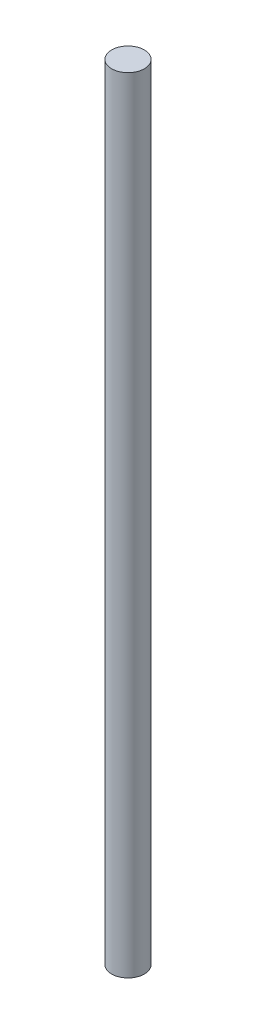
ISO-10303-21;
HEADER;
FILE_DESCRIPTION(('STEP AP214'),'2;1');
FILE_NAME('part.step','',(''),(''),'','','');
FILE_SCHEMA(('AUTOMOTIVE_DESIGN { 1 0 10303 214 1 1 1 1 }'));
ENDSEC;
DATA;
#1=APPLICATION_CONTEXT('core data for automotive mechanical design processes');
#2=APPLICATION_PROTOCOL_DEFINITION('international standard','automotive_design',2000,#1);
#3=PRODUCT_CONTEXT('',#1,'mechanical');
#4=PRODUCT('Part','Part','',(#3));
#5=PRODUCT_RELATED_PRODUCT_CATEGORY('part','',(#4));
#6=PRODUCT_DEFINITION_FORMATION('','',#4);
#7=PRODUCT_DEFINITION_CONTEXT('part definition',#1,'design');
#8=PRODUCT_DEFINITION('design','',#6,#7);
#9=PRODUCT_DEFINITION_SHAPE('','',#8);
#10=(LENGTH_UNIT() NAMED_UNIT(*) SI_UNIT(.MILLI.,.METRE.));
#11=(NAMED_UNIT(*) PLANE_ANGLE_UNIT() SI_UNIT($,.RADIAN.));
#12=(NAMED_UNIT(*) SI_UNIT($,.STERADIAN.) SOLID_ANGLE_UNIT());
#13=UNCERTAINTY_MEASURE_WITH_UNIT(LENGTH_MEASURE(1.E-05),#10,'distance_accuracy_value','');
#14=(GEOMETRIC_REPRESENTATION_CONTEXT(3) GLOBAL_UNCERTAINTY_ASSIGNED_CONTEXT((#13)) GLOBAL_UNIT_ASSIGNED_CONTEXT((#10,
#11,#12)) REPRESENTATION_CONTEXT('',''));
#15=CARTESIAN_POINT('',(0.,0.,0.));
#16=DIRECTION('',(0.,0.,1.));
#17=DIRECTION('',(1.,0.,0.));
#18=AXIS2_PLACEMENT_3D('',#15,#16,#17);
#19=CARTESIAN_POINT('',(0.,152.4,0.));
#20=DIRECTION('',(0.,-1.,0.));
#21=DIRECTION('',(0.,0.,-1.));
#22=AXIS2_PLACEMENT_3D('',#19,#20,#21);
#23=CYLINDRICAL_SURFACE('',#22,3.175);
#24=CARTESIAN_POINT('',(0.,152.4,0.));
#25=DIRECTION('',(0.,1.,0.));
#26=DIRECTION('',(0.,0.,1.));
#27=AXIS2_PLACEMENT_3D('',#24,#25,#26);
#28=CIRCLE('',#27,3.175);
#29=CARTESIAN_POINT('',(0.,152.4,-3.175));
#30=VERTEX_POINT('',#29);
#31=EDGE_CURVE('E10',#30,#30,#28,.T.);
#32=CARTESIAN_POINT('',(0.,0.,0.));
#33=DIRECTION('',(0.,1.,0.));
#34=DIRECTION('',(0.,0.,1.));
#35=AXIS2_PLACEMENT_3D('',#32,#33,#34);
#36=CIRCLE('',#35,3.175);
#37=CARTESIAN_POINT('',(0.,0.,-3.175));
#38=VERTEX_POINT('',#37);
#39=EDGE_CURVE('E34',#38,#38,#36,.T.);
#40=CARTESIAN_POINT('',(0.,152.4,-3.175));
#41=CARTESIAN_POINT('',(0.,150.8125,-3.175));
#42=CARTESIAN_POINT('',(0.,149.225,-3.175));
#43=CARTESIAN_POINT('',(0.,146.05,-3.175));
#44=CARTESIAN_POINT('',(0.,144.4625,-3.175));
#45=CARTESIAN_POINT('',(0.,141.2875,-3.175));
#46=CARTESIAN_POINT('',(0.,139.7,-3.175));
#47=CARTESIAN_POINT('',(0.,136.525,-3.175));
#48=CARTESIAN_POINT('',(0.,134.9375,-3.175));
#49=CARTESIAN_POINT('',(0.,131.7625,-3.175));
#50=CARTESIAN_POINT('',(0.,130.175,-3.175));
#51=CARTESIAN_POINT('',(0.,127.,-3.175));
#52=CARTESIAN_POINT('',(0.,125.4125,-3.175));
#53=CARTESIAN_POINT('',(0.,122.2375,-3.175));
#54=CARTESIAN_POINT('',(0.,120.65,-3.175));
#55=CARTESIAN_POINT('',(0.,117.475,-3.175));
#56=CARTESIAN_POINT('',(0.,115.8875,-3.175));
#57=CARTESIAN_POINT('',(0.,112.7125,-3.175));
#58=CARTESIAN_POINT('',(0.,111.125,-3.175));
#59=CARTESIAN_POINT('',(0.,107.95,-3.175));
#60=CARTESIAN_POINT('',(0.,106.3625,-3.175));
#61=CARTESIAN_POINT('',(0.,103.1875,-3.175));
#62=CARTESIAN_POINT('',(0.,101.6,-3.175));
#63=CARTESIAN_POINT('',(0.,98.425,-3.175));
#64=CARTESIAN_POINT('',(0.,96.8375,-3.175));
#65=CARTESIAN_POINT('',(0.,93.6625,-3.175));
#66=CARTESIAN_POINT('',(0.,92.075,-3.175));
#67=CARTESIAN_POINT('',(0.,88.9,-3.175));
#68=CARTESIAN_POINT('',(0.,87.3125,-3.175));
#69=CARTESIAN_POINT('',(0.,84.1375,-3.175));
#70=CARTESIAN_POINT('',(0.,82.55,-3.175));
#71=CARTESIAN_POINT('',(0.,79.375,-3.175));
#72=CARTESIAN_POINT('',(0.,77.7875,-3.175));
#73=CARTESIAN_POINT('',(0.,74.6125,-3.175));
#74=CARTESIAN_POINT('',(0.,73.025,-3.175));
#75=CARTESIAN_POINT('',(0.,69.85,-3.175));
#76=CARTESIAN_POINT('',(0.,68.2625,-3.175));
#77=CARTESIAN_POINT('',(0.,65.0875,-3.175));
#78=CARTESIAN_POINT('',(0.,63.5,-3.175));
#79=CARTESIAN_POINT('',(0.,60.325,-3.175));
#80=CARTESIAN_POINT('',(0.,58.7375,-3.175));
#81=CARTESIAN_POINT('',(0.,55.5625,-3.175));
#82=CARTESIAN_POINT('',(0.,53.975,-3.175));
#83=CARTESIAN_POINT('',(0.,50.8,-3.175));
#84=CARTESIAN_POINT('',(0.,49.2125,-3.175));
#85=CARTESIAN_POINT('',(0.,46.0375,-3.175));
#86=CARTESIAN_POINT('',(0.,44.45,-3.175));
#87=CARTESIAN_POINT('',(0.,41.275,-3.175));
#88=CARTESIAN_POINT('',(0.,39.6875,-3.175));
#89=CARTESIAN_POINT('',(0.,36.5125,-3.175));
#90=CARTESIAN_POINT('',(0.,34.925,-3.175));
#91=CARTESIAN_POINT('',(0.,31.75,-3.175));
#92=CARTESIAN_POINT('',(0.,30.1625,-3.175));
#93=CARTESIAN_POINT('',(0.,26.9875,-3.175));
#94=CARTESIAN_POINT('',(0.,25.4,-3.175));
#95=CARTESIAN_POINT('',(0.,22.225,-3.175));
#96=CARTESIAN_POINT('',(0.,20.6375,-3.175));
#97=CARTESIAN_POINT('',(0.,17.4625,-3.175));
#98=CARTESIAN_POINT('',(0.,15.875,-3.175));
#99=CARTESIAN_POINT('',(0.,12.7,-3.175));
#100=CARTESIAN_POINT('',(0.,11.1125,-3.175));
#101=CARTESIAN_POINT('',(0.,7.93750000000001,-3.175));
#102=CARTESIAN_POINT('',(0.,6.35,-3.175));
#103=CARTESIAN_POINT('',(0.,3.175,-3.175));
#104=CARTESIAN_POINT('',(0.,1.5875,-3.175));
#105=CARTESIAN_POINT('',(0.,0.,-3.175));
#106=B_SPLINE_CURVE_WITH_KNOTS('',3,(#40,#41,#42,#43,#44,#45,#46,#47,#48,#49,#50,#51,#52,#53,
#54,#55,#56,#57,#58,#59,#60,#61,#62,#63,#64,#65,#66,#67,#68,#69,#70,#71,#72,#73,#74,#75,#76,#77,
#78,#79,#80,#81,#82,#83,#84,#85,#86,#87,#88,#89,#90,#91,#92,#93,#94,#95,#96,#97,#98,#99,#100,
#101,#102,#103,#104,#105),.UNSPECIFIED.,.F.,.F.,(4,2,2,2,2,2,2,2,2,2,2,2,2,2,2,2,2,2,2,2,2,2,2,
2,2,2,2,2,2,2,2,2,4),(0.,4.7625,9.52500000000001,14.2875,19.05,23.8125,28.575,33.3375,38.1,
42.8625,47.625,52.3875,57.15,61.9125,66.675,71.4375,76.2,80.9625,85.725,90.4875,95.25,100.0125,
104.775,109.5375,114.3,119.0625,123.825,128.5875,133.35,138.1125,142.875,147.6375,152.4),.UNSPECIFIED.);
#107=EDGE_CURVE('BSEAM31',#30,#38,#106,.T.);
#108=ORIENTED_EDGE('',*,*,#31,.F.);
#109=ORIENTED_EDGE('',*,*,#39,.T.);
#110=ORIENTED_EDGE('',*,*,#107,.T.);
#111=ORIENTED_EDGE('',*,*,#107,.F.);
#112=EDGE_LOOP('',(#108,#110,#109,#111));
#113=FACE_BOUND('',#112,.T.);
#114=ADVANCED_FACE('F31',(#113),#23,.T.);
#115=CARTESIAN_POINT('',(0.,152.4,0.));
#116=DIRECTION('',(0.,1.,0.));
#117=DIRECTION('',(0.,0.,1.));
#118=AXIS2_PLACEMENT_3D('',#115,#116,#117);
#119=PLANE('',#118);
#120=ORIENTED_EDGE('',*,*,#31,.T.);
#121=EDGE_LOOP('',(#120));
#122=FACE_BOUND('',#121,.T.);
#123=ADVANCED_FACE('F46',(#122),#119,.T.);
#124=CARTESIAN_POINT('',(0.,0.,0.));
#125=DIRECTION('',(0.,1.,0.));
#126=DIRECTION('',(0.,0.,1.));
#127=AXIS2_PLACEMENT_3D('',#124,#125,#126);
#128=PLANE('',#127);
#129=ORIENTED_EDGE('',*,*,#39,.F.);
#130=EDGE_LOOP('',(#129));
#131=FACE_BOUND('',#130,.T.);
#132=ADVANCED_FACE('F44',(#131),#128,.F.);
#133=CLOSED_SHELL('',(#114,#123,#132));
#134=MANIFOLD_SOLID_BREP('B2',#133);
#135=ADVANCED_BREP_SHAPE_REPRESENTATION('',(#18,#134),#14);
#136=SHAPE_DEFINITION_REPRESENTATION(#9,#135);
ENDSEC;
END-ISO-10303-21;
